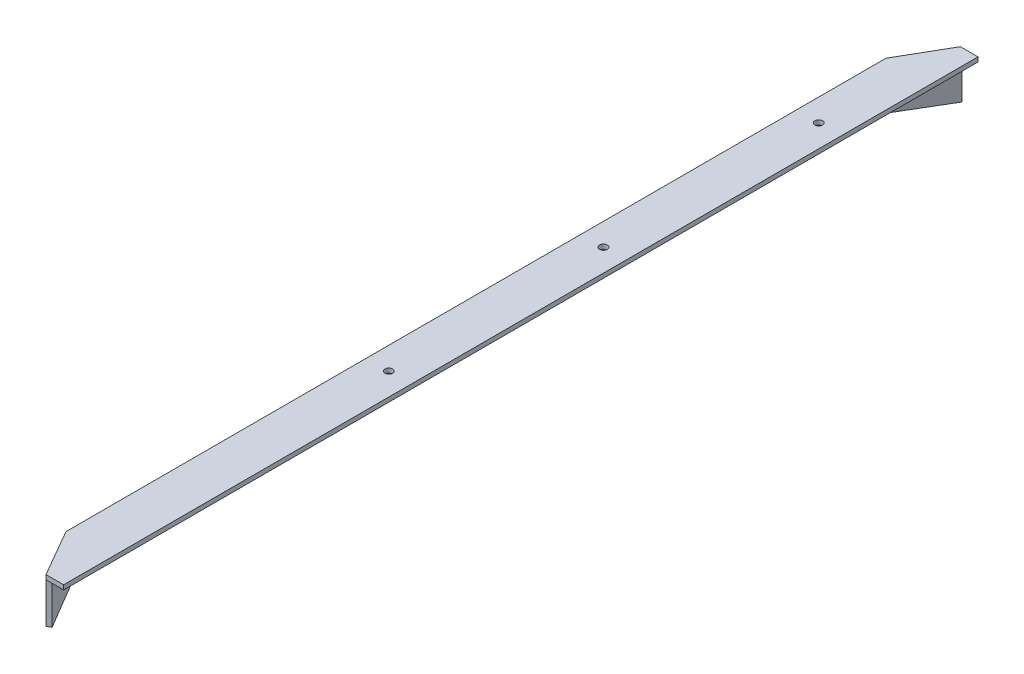
ISO-10303-21;
HEADER;
FILE_DESCRIPTION(('STEP AP214'),'2;1');
FILE_NAME('part.step','',(''),(''),'','','');
FILE_SCHEMA(('AUTOMOTIVE_DESIGN { 1 0 10303 214 1 1 1 1 }'));
ENDSEC;
DATA;
#1=APPLICATION_CONTEXT('core data for automotive mechanical design processes');
#2=APPLICATION_PROTOCOL_DEFINITION('international standard','automotive_design',2000,#1);
#3=PRODUCT_CONTEXT('',#1,'mechanical');
#4=PRODUCT('Part','Part','',(#3));
#5=PRODUCT_RELATED_PRODUCT_CATEGORY('part','',(#4));
#6=PRODUCT_DEFINITION_FORMATION('','',#4);
#7=PRODUCT_DEFINITION_CONTEXT('part definition',#1,'design');
#8=PRODUCT_DEFINITION('design','',#6,#7);
#9=PRODUCT_DEFINITION_SHAPE('','',#8);
#10=(LENGTH_UNIT() NAMED_UNIT(*) SI_UNIT(.MILLI.,.METRE.));
#11=(NAMED_UNIT(*) PLANE_ANGLE_UNIT() SI_UNIT($,.RADIAN.));
#12=(NAMED_UNIT(*) SI_UNIT($,.STERADIAN.) SOLID_ANGLE_UNIT());
#13=UNCERTAINTY_MEASURE_WITH_UNIT(LENGTH_MEASURE(1.E-05),#10,'distance_accuracy_value','');
#14=(GEOMETRIC_REPRESENTATION_CONTEXT(3) GLOBAL_UNCERTAINTY_ASSIGNED_CONTEXT((#13)) GLOBAL_UNIT_ASSIGNED_CONTEXT((#10,
#11,#12)) REPRESENTATION_CONTEXT('',''));
#15=CARTESIAN_POINT('',(0.,0.,0.));
#16=DIRECTION('',(0.,0.,1.));
#17=DIRECTION('',(1.,0.,0.));
#18=AXIS2_PLACEMENT_3D('',#15,#16,#17);
#19=CARTESIAN_POINT('',(7.,0.,640.));
#20=DIRECTION('',(0.,1.,0.));
#21=DIRECTION('',(-1.,0.,0.));
#22=AXIS2_PLACEMENT_3D('',#19,#20,#21);
#23=PLANE('',#22);
#24=DIRECTION('',(0.,0.,-1.));
#25=VECTOR('',#24,1.);
#26=CARTESIAN_POINT('',(0.,0.,640.));
#27=LINE('',#26,#25);
#28=CARTESIAN_POINT('',(0.,0.,640.));
#29=VERTEX_POINT('',#28);
#30=CARTESIAN_POINT('',(0.,0.,-640.));
#31=VERTEX_POINT('',#30);
#32=EDGE_CURVE('E211',#29,#31,#27,.T.);
#33=ORIENTED_EDGE('',*,*,#32,.T.);
#34=DIRECTION('',(0.5,0.,-0.866025403784439));
#35=VECTOR('',#34,1.);
#36=CARTESIAN_POINT('',(0.,0.,-640.));
#37=LINE('',#36,#35);
#38=CARTESIAN_POINT('',(42.5,0.,-713.612159321677));
#39=VERTEX_POINT('',#38);
#40=EDGE_CURVE('E134',#31,#39,#37,.T.);
#41=ORIENTED_EDGE('',*,*,#40,.T.);
#42=DIRECTION('',(0.866025403784443,0.,0.499999999999992));
#43=VECTOR('',#42,1.);
#44=CARTESIAN_POINT('',(42.5,0.,-713.612159321677));
#45=LINE('',#44,#43);
#46=CARTESIAN_POINT('',(48.5621778264911,0.,-710.112159321677));
#47=VERTEX_POINT('',#46);
#48=EDGE_CURVE('E163',#39,#47,#45,.T.);
#49=ORIENTED_EDGE('',*,*,#48,.T.);
#50=DIRECTION('',(-0.509931612811304,0.,0.860214944217817));
#51=VECTOR('',#50,1.);
#52=CARTESIAN_POINT('',(48.5621778264911,0.,-710.112159321677));
#53=LINE('',#52,#51);
#54=CARTESIAN_POINT('',(7.,0.,-640.));
#55=VERTEX_POINT('',#54);
#56=EDGE_CURVE('E157',#47,#55,#53,.T.);
#57=ORIENTED_EDGE('',*,*,#56,.T.);
#58=DIRECTION('',(0.,0.,-1.));
#59=VECTOR('',#58,1.);
#60=CARTESIAN_POINT('',(7.,0.,640.));
#61=LINE('',#60,#59);
#62=CARTESIAN_POINT('',(7.,0.,640.));
#63=VERTEX_POINT('',#62);
#64=EDGE_CURVE('E11',#63,#55,#61,.T.);
#65=ORIENTED_EDGE('',*,*,#64,.F.);
#66=DIRECTION('',(-0.509931612811304,0.,-0.860214944217817));
#67=VECTOR('',#66,1.);
#68=CARTESIAN_POINT('',(48.5621778264911,0.,710.112159321677));
#69=LINE('',#68,#67);
#70=CARTESIAN_POINT('',(48.5621778264911,0.,710.112159321677));
#71=VERTEX_POINT('',#70);
#72=EDGE_CURVE('E193',#71,#63,#69,.T.);
#73=ORIENTED_EDGE('',*,*,#72,.F.);
#74=DIRECTION('',(0.866025403784443,0.,-0.499999999999992));
#75=VECTOR('',#74,1.);
#76=CARTESIAN_POINT('',(42.5,0.,713.612159321677));
#77=LINE('',#76,#75);
#78=CARTESIAN_POINT('',(42.5,0.,713.612159321677));
#79=VERTEX_POINT('',#78);
#80=EDGE_CURVE('E198',#79,#71,#77,.T.);
#81=ORIENTED_EDGE('',*,*,#80,.F.);
#82=DIRECTION('',(0.5,0.,0.866025403784439));
#83=VECTOR('',#82,1.);
#84=CARTESIAN_POINT('',(0.,0.,640.));
#85=LINE('',#84,#83);
#86=EDGE_CURVE('E188',#29,#79,#85,.T.);
#87=ORIENTED_EDGE('',*,*,#86,.F.);
#88=EDGE_LOOP('',(#33,#41,#49,#57,#65,#73,#81,#87));
#89=FACE_BOUND('',#88,.T.);
#90=ADVANCED_FACE('F39',(#89),#23,.F.);
#91=CARTESIAN_POINT('',(6.99999999999999,63.,640.));
#92=DIRECTION('',(-1.,0.,0.));
#93=DIRECTION('',(0.,-1.,0.));
#94=AXIS2_PLACEMENT_3D('',#91,#92,#93);
#95=PLANE('',#94);
#96=ORIENTED_EDGE('',*,*,#64,.T.);
#97=DIRECTION('',(0.,1.,0.));
#98=VECTOR('',#97,1.);
#99=CARTESIAN_POINT('',(6.99999999999999,63.,-640.));
#100=LINE('',#99,#98);
#101=CARTESIAN_POINT('',(6.99999999999999,63.,-640.));
#102=VERTEX_POINT('',#101);
#103=EDGE_CURVE('E171',#55,#102,#100,.T.);
#104=ORIENTED_EDGE('',*,*,#103,.T.);
#105=DIRECTION('',(0.,0.,-1.));
#106=VECTOR('',#105,1.);
#107=CARTESIAN_POINT('',(6.99999999999999,63.,640.));
#108=LINE('',#107,#106);
#109=CARTESIAN_POINT('',(6.99999999999999,63.,640.));
#110=VERTEX_POINT('',#109);
#111=EDGE_CURVE('E47',#110,#102,#108,.T.);
#112=ORIENTED_EDGE('',*,*,#111,.F.);
#113=DIRECTION('',(0.,1.,0.));
#114=VECTOR('',#113,1.);
#115=CARTESIAN_POINT('',(6.99999999999999,63.,640.));
#116=LINE('',#115,#114);
#117=EDGE_CURVE('E207',#63,#110,#116,.T.);
#118=ORIENTED_EDGE('',*,*,#117,.F.);
#119=EDGE_LOOP('',(#96,#104,#112,#118));
#120=FACE_BOUND('',#119,.T.);
#121=ADVANCED_FACE('F260',(#120),#95,.F.);
#122=CARTESIAN_POINT('',(70.,63.,640.));
#123=DIRECTION('',(0.,1.,0.));
#124=DIRECTION('',(-1.,0.,0.));
#125=AXIS2_PLACEMENT_3D('',#122,#123,#124);
#126=PLANE('',#125);
#127=CARTESIAN_POINT('',(35.,63.,-500.));
#128=DIRECTION('',(0.,1.,0.));
#129=DIRECTION('',(-1.,0.,0.));
#130=AXIS2_PLACEMENT_3D('',#127,#128,#129);
#131=CIRCLE('',#130,6.);
#132=CARTESIAN_POINT('',(29.,63.,-500.));
#133=VERTEX_POINT('',#132);
#134=EDGE_CURVE('E151',#133,#133,#131,.F.);
#135=ORIENTED_EDGE('',*,*,#134,.F.);
#136=EDGE_LOOP('',(#135));
#137=FACE_BOUND('',#136,.T.);
#138=CARTESIAN_POINT('',(35.,63.,-164.));
#139=DIRECTION('',(0.,1.,0.));
#140=DIRECTION('',(-1.,0.,0.));
#141=AXIS2_PLACEMENT_3D('',#138,#139,#140);
#142=CIRCLE('',#141,6.);
#143=CARTESIAN_POINT('',(29.,63.,-164.));
#144=VERTEX_POINT('',#143);
#145=EDGE_CURVE('E223',#144,#144,#142,.F.);
#146=ORIENTED_EDGE('',*,*,#145,.F.);
#147=EDGE_LOOP('',(#146));
#148=FACE_BOUND('',#147,.T.);
#149=CARTESIAN_POINT('',(35.,63.,171.));
#150=DIRECTION('',(0.,1.,0.));
#151=DIRECTION('',(-1.,0.,0.));
#152=AXIS2_PLACEMENT_3D('',#149,#150,#151);
#153=CIRCLE('',#152,6.);
#154=CARTESIAN_POINT('',(29.,63.,171.));
#155=VERTEX_POINT('',#154);
#156=EDGE_CURVE('E220',#155,#155,#153,.F.);
#157=ORIENTED_EDGE('',*,*,#156,.F.);
#158=EDGE_LOOP('',(#157));
#159=FACE_BOUND('',#158,.T.);
#160=ORIENTED_EDGE('',*,*,#111,.T.);
#161=DIRECTION('',(-0.509931612811304,0.,0.860214944217817));
#162=VECTOR('',#161,1.);
#163=CARTESIAN_POINT('',(48.5621778264911,63.,-710.112159321677));
#164=LINE('',#163,#162);
#165=CARTESIAN_POINT('',(48.5621778264911,63.,-710.112159321677));
#166=VERTEX_POINT('',#165);
#167=EDGE_CURVE('E156',#166,#102,#164,.T.);
#168=ORIENTED_EDGE('',*,*,#167,.F.);
#169=DIRECTION('',(0.866025403784443,0.,0.499999999999992));
#170=VECTOR('',#169,1.);
#171=CARTESIAN_POINT('',(42.5,63.,-713.612159321677));
#172=LINE('',#171,#170);
#173=CARTESIAN_POINT('',(42.5,63.,-713.612159321677));
#174=VERTEX_POINT('',#173);
#175=EDGE_CURVE('E153',#174,#166,#172,.T.);
#176=ORIENTED_EDGE('',*,*,#175,.F.);
#177=DIRECTION('',(1.,0.,0.));
#178=VECTOR('',#177,1.);
#179=CARTESIAN_POINT('',(42.5,63.,-713.612159321677));
#180=LINE('',#179,#178);
#181=CARTESIAN_POINT('',(70.,63.,-713.612159321677));
#182=VERTEX_POINT('',#181);
#183=EDGE_CURVE('E131',#174,#182,#180,.T.);
#184=ORIENTED_EDGE('',*,*,#183,.T.);
#185=DIRECTION('',(0.,0.,-1.));
#186=VECTOR('',#185,1.);
#187=CARTESIAN_POINT('',(70.,63.,640.));
#188=LINE('',#187,#186);
#189=CARTESIAN_POINT('',(70.,63.,713.612159321677));
#190=VERTEX_POINT('',#189);
#191=EDGE_CURVE('E215',#190,#182,#188,.T.);
#192=ORIENTED_EDGE('',*,*,#191,.F.);
#193=DIRECTION('',(1.,0.,0.));
#194=VECTOR('',#193,1.);
#195=CARTESIAN_POINT('',(42.5,63.,713.612159321677));
#196=LINE('',#195,#194);
#197=CARTESIAN_POINT('',(42.5,63.,713.612159321677));
#198=VERTEX_POINT('',#197);
#199=EDGE_CURVE('E175',#198,#190,#196,.T.);
#200=ORIENTED_EDGE('',*,*,#199,.F.);
#201=DIRECTION('',(0.866025403784443,0.,-0.499999999999992));
#202=VECTOR('',#201,1.);
#203=CARTESIAN_POINT('',(42.5,63.,713.612159321677));
#204=LINE('',#203,#202);
#205=CARTESIAN_POINT('',(48.5621778264911,63.,710.112159321677));
#206=VERTEX_POINT('',#205);
#207=EDGE_CURVE('E189',#198,#206,#204,.T.);
#208=ORIENTED_EDGE('',*,*,#207,.T.);
#209=DIRECTION('',(-0.509931612811304,0.,-0.860214944217817));
#210=VECTOR('',#209,1.);
#211=CARTESIAN_POINT('',(48.5621778264911,63.,710.112159321677));
#212=LINE('',#211,#210);
#213=EDGE_CURVE('E192',#206,#110,#212,.T.);
#214=ORIENTED_EDGE('',*,*,#213,.T.);
#215=EDGE_LOOP('',(#160,#168,#176,#184,#192,#200,#208,#214));
#216=FACE_BOUND('',#215,.T.);
#217=ADVANCED_FACE('F266',(#137,#148,#159,#216),#126,.F.);
#218=CARTESIAN_POINT('',(70.,70.,640.));
#219=DIRECTION('',(-1.,0.,0.));
#220=DIRECTION('',(0.,0.,1.));
#221=AXIS2_PLACEMENT_3D('',#218,#219,#220);
#222=PLANE('',#221);
#223=ORIENTED_EDGE('',*,*,#191,.T.);
#224=DIRECTION('',(0.,-1.,0.));
#225=VECTOR('',#224,1.);
#226=CARTESIAN_POINT('',(70.,70.,-713.612159321677));
#227=LINE('',#226,#225);
#228=CARTESIAN_POINT('',(70.,70.,-713.612159321677));
#229=VERTEX_POINT('',#228);
#230=EDGE_CURVE('E135',#229,#182,#227,.T.);
#231=ORIENTED_EDGE('',*,*,#230,.F.);
#232=DIRECTION('',(0.,0.,-1.));
#233=VECTOR('',#232,1.);
#234=CARTESIAN_POINT('',(70.,70.,640.));
#235=LINE('',#234,#233);
#236=CARTESIAN_POINT('',(70.,70.,713.612159321677));
#237=VERTEX_POINT('',#236);
#238=EDGE_CURVE('E146',#237,#229,#235,.T.);
#239=ORIENTED_EDGE('',*,*,#238,.F.);
#240=DIRECTION('',(0.,-1.,0.));
#241=VECTOR('',#240,1.);
#242=CARTESIAN_POINT('',(70.,70.,713.612159321677));
#243=LINE('',#242,#241);
#244=EDGE_CURVE('E180',#237,#190,#243,.T.);
#245=ORIENTED_EDGE('',*,*,#244,.T.);
#246=EDGE_LOOP('',(#223,#231,#239,#245));
#247=FACE_BOUND('',#246,.T.);
#248=ADVANCED_FACE('F243',(#247),#222,.F.);
#249=CARTESIAN_POINT('',(0.,70.,640.));
#250=DIRECTION('',(0.,-1.,0.));
#251=DIRECTION('',(0.,0.,-1.));
#252=AXIS2_PLACEMENT_3D('',#249,#250,#251);
#253=PLANE('',#252);
#254=CARTESIAN_POINT('',(35.,70.,-500.));
#255=DIRECTION('',(0.,-1.,0.));
#256=DIRECTION('',(0.,0.,-1.));
#257=AXIS2_PLACEMENT_3D('',#254,#255,#256);
#258=CIRCLE('',#257,6.);
#259=CARTESIAN_POINT('',(35.,70.,-506.));
#260=VERTEX_POINT('',#259);
#261=EDGE_CURVE('E42',#260,#260,#258,.F.);
#262=ORIENTED_EDGE('',*,*,#261,.F.);
#263=EDGE_LOOP('',(#262));
#264=FACE_BOUND('',#263,.T.);
#265=CARTESIAN_POINT('',(35.,70.,-164.));
#266=DIRECTION('',(0.,-1.,0.));
#267=DIRECTION('',(0.,0.,-1.));
#268=AXIS2_PLACEMENT_3D('',#265,#266,#267);
#269=CIRCLE('',#268,6.);
#270=CARTESIAN_POINT('',(35.,70.,-170.));
#271=VERTEX_POINT('',#270);
#272=EDGE_CURVE('E221',#271,#271,#269,.F.);
#273=ORIENTED_EDGE('',*,*,#272,.F.);
#274=EDGE_LOOP('',(#273));
#275=FACE_BOUND('',#274,.T.);
#276=CARTESIAN_POINT('',(35.,70.,171.));
#277=DIRECTION('',(0.,-1.,0.));
#278=DIRECTION('',(0.,0.,-1.));
#279=AXIS2_PLACEMENT_3D('',#276,#277,#278);
#280=CIRCLE('',#279,6.);
#281=CARTESIAN_POINT('',(35.,70.,165.));
#282=VERTEX_POINT('',#281);
#283=EDGE_CURVE('E218',#282,#282,#280,.F.);
#284=ORIENTED_EDGE('',*,*,#283,.F.);
#285=EDGE_LOOP('',(#284));
#286=FACE_BOUND('',#285,.T.);
#287=ORIENTED_EDGE('',*,*,#238,.T.);
#288=DIRECTION('',(1.,0.,0.));
#289=VECTOR('',#288,1.);
#290=CARTESIAN_POINT('',(42.5,70.,-713.612159321677));
#291=LINE('',#290,#289);
#292=CARTESIAN_POINT('',(42.5,70.,-713.612159321677));
#293=VERTEX_POINT('',#292);
#294=EDGE_CURVE('E128',#293,#229,#291,.T.);
#295=ORIENTED_EDGE('',*,*,#294,.F.);
#296=DIRECTION('',(0.5,0.,-0.866025403784439));
#297=VECTOR('',#296,1.);
#298=CARTESIAN_POINT('',(0.,70.,-640.));
#299=LINE('',#298,#297);
#300=CARTESIAN_POINT('',(0.,70.,-640.));
#301=VERTEX_POINT('',#300);
#302=EDGE_CURVE('E138',#301,#293,#299,.T.);
#303=ORIENTED_EDGE('',*,*,#302,.F.);
#304=DIRECTION('',(0.,0.,-1.));
#305=VECTOR('',#304,1.);
#306=CARTESIAN_POINT('',(0.,70.,640.));
#307=LINE('',#306,#305);
#308=CARTESIAN_POINT('',(0.,70.,640.));
#309=VERTEX_POINT('',#308);
#310=EDGE_CURVE('E63',#309,#301,#307,.T.);
#311=ORIENTED_EDGE('',*,*,#310,.F.);
#312=DIRECTION('',(0.5,0.,0.866025403784439));
#313=VECTOR('',#312,1.);
#314=CARTESIAN_POINT('',(0.,70.,640.));
#315=LINE('',#314,#313);
#316=CARTESIAN_POINT('',(42.5,70.,713.612159321677));
#317=VERTEX_POINT('',#316);
#318=EDGE_CURVE('E176',#309,#317,#315,.T.);
#319=ORIENTED_EDGE('',*,*,#318,.T.);
#320=DIRECTION('',(1.,0.,0.));
#321=VECTOR('',#320,1.);
#322=CARTESIAN_POINT('',(42.5,70.,713.612159321677));
#323=LINE('',#322,#321);
#324=EDGE_CURVE('E178',#317,#237,#323,.T.);
#325=ORIENTED_EDGE('',*,*,#324,.T.);
#326=EDGE_LOOP('',(#287,#295,#303,#311,#319,#325));
#327=FACE_BOUND('',#326,.T.);
#328=ADVANCED_FACE('F144',(#264,#275,#286,#327),#253,.F.);
#329=CARTESIAN_POINT('',(0.,0.,640.));
#330=DIRECTION('',(1.,0.,0.));
#331=DIRECTION('',(0.,0.,-1.));
#332=AXIS2_PLACEMENT_3D('',#329,#330,#331);
#333=PLANE('',#332);
#334=ORIENTED_EDGE('',*,*,#310,.T.);
#335=DIRECTION('',(0.,-1.,0.));
#336=VECTOR('',#335,1.);
#337=CARTESIAN_POINT('',(0.,0.,-640.));
#338=LINE('',#337,#336);
#339=EDGE_CURVE('E142',#301,#31,#338,.T.);
#340=ORIENTED_EDGE('',*,*,#339,.T.);
#341=ORIENTED_EDGE('',*,*,#32,.F.);
#342=DIRECTION('',(0.,-1.,0.));
#343=VECTOR('',#342,1.);
#344=CARTESIAN_POINT('',(0.,0.,640.));
#345=LINE('',#344,#343);
#346=EDGE_CURVE('E55',#309,#29,#345,.T.);
#347=ORIENTED_EDGE('',*,*,#346,.F.);
#348=EDGE_LOOP('',(#334,#340,#341,#347));
#349=FACE_BOUND('',#348,.T.);
#350=ADVANCED_FACE('F242',(#349),#333,.F.);
#351=CARTESIAN_POINT('',(0.,63.,640.));
#352=DIRECTION('',(0.866025403784439,0.,-0.5));
#353=DIRECTION('',(-0.5,0.,-0.866025403784439));
#354=AXIS2_PLACEMENT_3D('',#351,#352,#353);
#355=PLANE('',#354);
#356=ORIENTED_EDGE('',*,*,#86,.T.);
#357=DIRECTION('',(0.,-1.,0.));
#358=VECTOR('',#357,1.);
#359=CARTESIAN_POINT('',(42.5,63.,713.612159321677));
#360=LINE('',#359,#358);
#361=EDGE_CURVE('E204',#198,#79,#360,.T.);
#362=ORIENTED_EDGE('',*,*,#361,.F.);
#363=DIRECTION('',(0.,-1.,0.));
#364=VECTOR('',#363,1.);
#365=CARTESIAN_POINT('',(42.5,70.,713.612159321677));
#366=LINE('',#365,#364);
#367=EDGE_CURVE('E185',#317,#198,#366,.T.);
#368=ORIENTED_EDGE('',*,*,#367,.F.);
#369=ORIENTED_EDGE('',*,*,#318,.F.);
#370=ORIENTED_EDGE('',*,*,#346,.T.);
#371=EDGE_LOOP('',(#356,#362,#368,#369,#370));
#372=FACE_BOUND('',#371,.T.);
#373=ADVANCED_FACE('F289',(#372),#355,.F.);
#374=CARTESIAN_POINT('',(42.5,63.,713.612159321677));
#375=DIRECTION('',(-0.499999999999992,0.,-0.866025403784443));
#376=DIRECTION('',(-0.866025403784443,0.,0.499999999999992));
#377=AXIS2_PLACEMENT_3D('',#374,#375,#376);
#378=PLANE('',#377);
#379=ORIENTED_EDGE('',*,*,#80,.T.);
#380=DIRECTION('',(0.,-1.,0.));
#381=VECTOR('',#380,1.);
#382=CARTESIAN_POINT('',(48.5621778264911,63.,710.112159321677));
#383=LINE('',#382,#381);
#384=EDGE_CURVE('E196',#206,#71,#383,.T.);
#385=ORIENTED_EDGE('',*,*,#384,.F.);
#386=ORIENTED_EDGE('',*,*,#207,.F.);
#387=ORIENTED_EDGE('',*,*,#361,.T.);
#388=EDGE_LOOP('',(#379,#385,#386,#387));
#389=FACE_BOUND('',#388,.T.);
#390=ADVANCED_FACE('F287',(#389),#378,.F.);
#391=CARTESIAN_POINT('',(48.5621778264911,63.,710.112159321677));
#392=DIRECTION('',(-0.860214944217817,0.,0.509931612811304));
#393=DIRECTION('',(0.509931612811304,0.,0.860214944217817));
#394=AXIS2_PLACEMENT_3D('',#391,#392,#393);
#395=PLANE('',#394);
#396=ORIENTED_EDGE('',*,*,#72,.T.);
#397=ORIENTED_EDGE('',*,*,#117,.T.);
#398=ORIENTED_EDGE('',*,*,#213,.F.);
#399=ORIENTED_EDGE('',*,*,#384,.T.);
#400=EDGE_LOOP('',(#396,#397,#398,#399));
#401=FACE_BOUND('',#400,.T.);
#402=ADVANCED_FACE('F282',(#401),#395,.F.);
#403=CARTESIAN_POINT('',(42.5,70.,713.612159321677));
#404=DIRECTION('',(0.,0.,-1.));
#405=DIRECTION('',(-1.,0.,0.));
#406=AXIS2_PLACEMENT_3D('',#403,#404,#405);
#407=PLANE('',#406);
#408=ORIENTED_EDGE('',*,*,#199,.T.);
#409=ORIENTED_EDGE('',*,*,#244,.F.);
#410=ORIENTED_EDGE('',*,*,#324,.F.);
#411=ORIENTED_EDGE('',*,*,#367,.T.);
#412=EDGE_LOOP('',(#408,#409,#410,#411));
#413=FACE_BOUND('',#412,.T.);
#414=ADVANCED_FACE('F292',(#413),#407,.F.);
#415=CARTESIAN_POINT('',(0.,63.,-640.));
#416=DIRECTION('',(0.866025403784439,0.,0.5));
#417=DIRECTION('',(-0.5,0.,0.866025403784439));
#418=AXIS2_PLACEMENT_3D('',#415,#416,#417);
#419=PLANE('',#418);
#420=ORIENTED_EDGE('',*,*,#40,.F.);
#421=ORIENTED_EDGE('',*,*,#339,.F.);
#422=ORIENTED_EDGE('',*,*,#302,.T.);
#423=DIRECTION('',(0.,-1.,0.));
#424=VECTOR('',#423,1.);
#425=CARTESIAN_POINT('',(42.5,70.,-713.612159321677));
#426=LINE('',#425,#424);
#427=EDGE_CURVE('E123',#293,#174,#426,.T.);
#428=ORIENTED_EDGE('',*,*,#427,.T.);
#429=DIRECTION('',(0.,-1.,0.));
#430=VECTOR('',#429,1.);
#431=CARTESIAN_POINT('',(42.5,63.,-713.612159321677));
#432=LINE('',#431,#430);
#433=EDGE_CURVE('E169',#174,#39,#432,.T.);
#434=ORIENTED_EDGE('',*,*,#433,.T.);
#435=EDGE_LOOP('',(#420,#421,#422,#428,#434));
#436=FACE_BOUND('',#435,.T.);
#437=ADVANCED_FACE('F140',(#436),#419,.F.);
#438=CARTESIAN_POINT('',(42.5,63.,-713.612159321677));
#439=DIRECTION('',(-0.499999999999992,0.,0.866025403784443));
#440=DIRECTION('',(-0.866025403784443,0.,-0.499999999999992));
#441=AXIS2_PLACEMENT_3D('',#438,#439,#440);
#442=PLANE('',#441);
#443=ORIENTED_EDGE('',*,*,#48,.F.);
#444=ORIENTED_EDGE('',*,*,#433,.F.);
#445=ORIENTED_EDGE('',*,*,#175,.T.);
#446=DIRECTION('',(0.,-1.,0.));
#447=VECTOR('',#446,1.);
#448=CARTESIAN_POINT('',(48.5621778264911,63.,-710.112159321677));
#449=LINE('',#448,#447);
#450=EDGE_CURVE('E160',#166,#47,#449,.T.);
#451=ORIENTED_EDGE('',*,*,#450,.T.);
#452=EDGE_LOOP('',(#443,#444,#445,#451));
#453=FACE_BOUND('',#452,.T.);
#454=ADVANCED_FACE('F273',(#453),#442,.F.);
#455=CARTESIAN_POINT('',(48.5621778264911,63.,-710.112159321677));
#456=DIRECTION('',(-0.860214944217817,0.,-0.509931612811304));
#457=DIRECTION('',(0.509931612811304,0.,-0.860214944217817));
#458=AXIS2_PLACEMENT_3D('',#455,#456,#457);
#459=PLANE('',#458);
#460=ORIENTED_EDGE('',*,*,#56,.F.);
#461=ORIENTED_EDGE('',*,*,#450,.F.);
#462=ORIENTED_EDGE('',*,*,#167,.T.);
#463=ORIENTED_EDGE('',*,*,#103,.F.);
#464=EDGE_LOOP('',(#460,#461,#462,#463));
#465=FACE_BOUND('',#464,.T.);
#466=ADVANCED_FACE('F257',(#465),#459,.F.);
#467=CARTESIAN_POINT('',(42.5,70.,-713.612159321677));
#468=DIRECTION('',(0.,0.,1.));
#469=DIRECTION('',(-1.,0.,0.));
#470=AXIS2_PLACEMENT_3D('',#467,#468,#469);
#471=PLANE('',#470);
#472=ORIENTED_EDGE('',*,*,#183,.F.);
#473=ORIENTED_EDGE('',*,*,#427,.F.);
#474=ORIENTED_EDGE('',*,*,#294,.T.);
#475=ORIENTED_EDGE('',*,*,#230,.T.);
#476=EDGE_LOOP('',(#472,#473,#474,#475));
#477=FACE_BOUND('',#476,.T.);
#478=ADVANCED_FACE('F125',(#477),#471,.F.);
#479=CARTESIAN_POINT('',(35.,80.,171.));
#480=DIRECTION('',(0.,-1.,0.));
#481=DIRECTION('',(0.,0.,-1.));
#482=AXIS2_PLACEMENT_3D('',#479,#480,#481);
#483=CYLINDRICAL_SURFACE('',#482,6.);
#484=ORIENTED_EDGE('',*,*,#283,.T.);
#485=EDGE_LOOP('',(#484));
#486=FACE_BOUND('',#485,.T.);
#487=ORIENTED_EDGE('',*,*,#156,.T.);
#488=EDGE_LOOP('',(#487));
#489=FACE_BOUND('',#488,.T.);
#490=ADVANCED_FACE('F248',(#486,#489),#483,.F.);
#491=CARTESIAN_POINT('',(35.,80.,-164.));
#492=DIRECTION('',(0.,-1.,0.));
#493=DIRECTION('',(0.,0.,-1.));
#494=AXIS2_PLACEMENT_3D('',#491,#492,#493);
#495=CYLINDRICAL_SURFACE('',#494,6.);
#496=ORIENTED_EDGE('',*,*,#272,.T.);
#497=EDGE_LOOP('',(#496));
#498=FACE_BOUND('',#497,.T.);
#499=ORIENTED_EDGE('',*,*,#145,.T.);
#500=EDGE_LOOP('',(#499));
#501=FACE_BOUND('',#500,.T.);
#502=ADVANCED_FACE('F250',(#498,#501),#495,.F.);
#503=CARTESIAN_POINT('',(35.,80.,-500.));
#504=DIRECTION('',(0.,-1.,0.));
#505=DIRECTION('',(0.,0.,-1.));
#506=AXIS2_PLACEMENT_3D('',#503,#504,#505);
#507=CYLINDRICAL_SURFACE('',#506,6.);
#508=ORIENTED_EDGE('',*,*,#261,.T.);
#509=EDGE_LOOP('',(#508));
#510=FACE_BOUND('',#509,.T.);
#511=ORIENTED_EDGE('',*,*,#134,.T.);
#512=EDGE_LOOP('',(#511));
#513=FACE_BOUND('',#512,.T.);
#514=ADVANCED_FACE('F238',(#510,#513),#507,.F.);
#515=CLOSED_SHELL('',(#90,#121,#217,#248,#328,#350,#373,#390,#402,#414,#437,#454,#466,#478,#490,
#502,#514));
#516=MANIFOLD_SOLID_BREP('B2',#515);
#517=ADVANCED_BREP_SHAPE_REPRESENTATION('',(#18,#516),#14);
#518=SHAPE_DEFINITION_REPRESENTATION(#9,#517);
ENDSEC;
END-ISO-10303-21;
